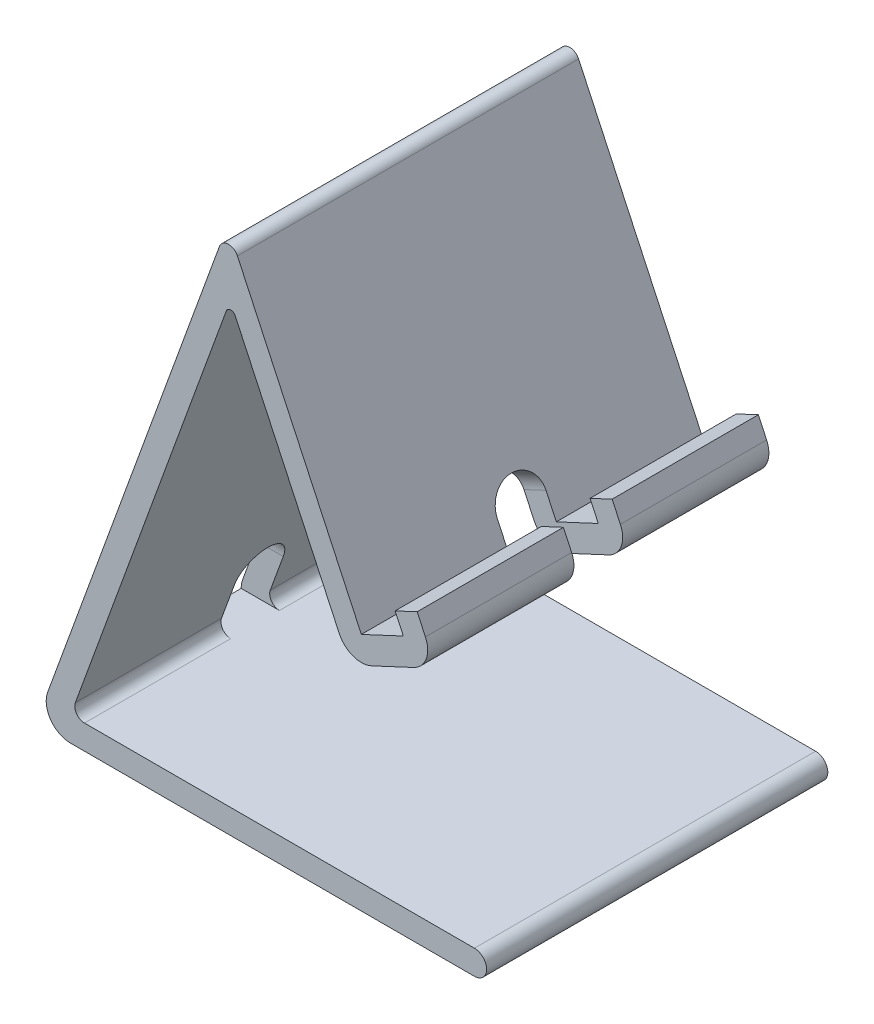
ISO-10303-21;
HEADER;
FILE_DESCRIPTION(('STEP AP214'),'2;1');
FILE_NAME('part.step','',(''),(''),'','','');
FILE_SCHEMA(('AUTOMOTIVE_DESIGN { 1 0 10303 214 1 1 1 1 }'));
ENDSEC;
DATA;
#1=APPLICATION_CONTEXT('core data for automotive mechanical design processes');
#2=APPLICATION_PROTOCOL_DEFINITION('international standard','automotive_design',2000,#1);
#3=PRODUCT_CONTEXT('',#1,'mechanical');
#4=PRODUCT('Part','Part','',(#3));
#5=PRODUCT_RELATED_PRODUCT_CATEGORY('part','',(#4));
#6=PRODUCT_DEFINITION_FORMATION('','',#4);
#7=PRODUCT_DEFINITION_CONTEXT('part definition',#1,'design');
#8=PRODUCT_DEFINITION('design','',#6,#7);
#9=PRODUCT_DEFINITION_SHAPE('','',#8);
#10=(LENGTH_UNIT() NAMED_UNIT(*) SI_UNIT(.MILLI.,.METRE.));
#11=(NAMED_UNIT(*) PLANE_ANGLE_UNIT() SI_UNIT($,.RADIAN.));
#12=(NAMED_UNIT(*) SI_UNIT($,.STERADIAN.) SOLID_ANGLE_UNIT());
#13=UNCERTAINTY_MEASURE_WITH_UNIT(LENGTH_MEASURE(1.E-05),#10,'distance_accuracy_value','');
#14=(GEOMETRIC_REPRESENTATION_CONTEXT(3) GLOBAL_UNCERTAINTY_ASSIGNED_CONTEXT((#13)) GLOBAL_UNIT_ASSIGNED_CONTEXT((#10,
#11,#12)) REPRESENTATION_CONTEXT('',''));
#15=CARTESIAN_POINT('',(0.,0.,0.));
#16=DIRECTION('',(0.,0.,1.));
#17=DIRECTION('',(1.,0.,0.));
#18=AXIS2_PLACEMENT_3D('',#15,#16,#17);
#19=CARTESIAN_POINT('',(7.1407400337106,5.,-70.));
#20=DIRECTION('',(0.,0.,1.));
#21=DIRECTION('',(1.,0.,0.));
#22=AXIS2_PLACEMENT_3D('',#19,#20,#21);
#23=CYLINDRICAL_SURFACE('',#22,5.);
#24=CARTESIAN_POINT('',(7.1407400337106,5.,-30.));
#25=DIRECTION('',(0.,0.,-1.));
#26=DIRECTION('',(-1.,0.,0.));
#27=AXIS2_PLACEMENT_3D('',#24,#25,#26);
#28=CIRCLE('',#27,5.);
#29=CARTESIAN_POINT('',(2.1407400337106,4.99999999999999,-30.));
#30=VERTEX_POINT('',#29);
#31=CARTESIAN_POINT('',(2.44227692978109,6.71010071662841,-30.));
#32=VERTEX_POINT('',#31);
#33=EDGE_CURVE('E291',#30,#32,#28,.T.);
#34=ORIENTED_EDGE('',*,*,#33,.F.);
#35=DIRECTION('',(0.,0.,1.));
#36=VECTOR('',#35,1.);
#37=CARTESIAN_POINT('',(2.1407400337106,4.99999999999999,-70.));
#38=LINE('',#37,#36);
#39=CARTESIAN_POINT('',(2.1407400337106,4.99999999999999,-40.));
#40=VERTEX_POINT('',#39);
#41=EDGE_CURVE('E299',#30,#40,#38,.F.);
#42=ORIENTED_EDGE('',*,*,#41,.T.);
#43=CARTESIAN_POINT('',(7.1407400337106,5.,-40.));
#44=DIRECTION('',(0.,0.,-1.));
#45=DIRECTION('',(0.,1.,0.));
#46=AXIS2_PLACEMENT_3D('',#43,#44,#45);
#47=CIRCLE('',#46,5.);
#48=CARTESIAN_POINT('',(2.44227692978109,6.71010071662841,-40.));
#49=VERTEX_POINT('',#48);
#50=EDGE_CURVE('E293',#40,#49,#47,.T.);
#51=ORIENTED_EDGE('',*,*,#50,.T.);
#52=DIRECTION('',(0.,0.,1.));
#53=VECTOR('',#52,1.);
#54=CARTESIAN_POINT('',(2.44227692978109,6.71010071662841,-70.));
#55=LINE('',#54,#53);
#56=CARTESIAN_POINT('',(2.44227692978109,6.71010071662841,-70.));
#57=VERTEX_POINT('',#56);
#58=EDGE_CURVE('E506',#57,#49,#55,.T.);
#59=ORIENTED_EDGE('',*,*,#58,.F.);
#60=CARTESIAN_POINT('',(7.1407400337106,5.,-70.));
#61=DIRECTION('',(0.,0.,1.));
#62=DIRECTION('',(1.,0.,0.));
#63=AXIS2_PLACEMENT_3D('',#60,#61,#62);
#64=CIRCLE('',#63,5.);
#65=CARTESIAN_POINT('',(7.14074003371066,0.,-70.));
#66=VERTEX_POINT('',#65);
#67=EDGE_CURVE('E372',#66,#57,#64,.F.);
#68=ORIENTED_EDGE('',*,*,#67,.F.);
#69=DIRECTION('',(0.,0.,1.));
#70=VECTOR('',#69,1.);
#71=CARTESIAN_POINT('',(7.14074003371066,0.,-70.));
#72=LINE('',#71,#70);
#73=CARTESIAN_POINT('',(7.14074003371066,0.,0.));
#74=VERTEX_POINT('',#73);
#75=EDGE_CURVE('E436',#66,#74,#72,.T.);
#76=ORIENTED_EDGE('',*,*,#75,.T.);
#77=CARTESIAN_POINT('',(7.1407400337106,5.,0.));
#78=DIRECTION('',(0.,0.,1.));
#79=DIRECTION('',(1.,0.,0.));
#80=AXIS2_PLACEMENT_3D('',#77,#78,#79);
#81=CIRCLE('',#80,5.);
#82=CARTESIAN_POINT('',(2.44227692978109,6.71010071662841,0.));
#83=VERTEX_POINT('',#82);
#84=EDGE_CURVE('E371',#74,#83,#81,.F.);
#85=ORIENTED_EDGE('',*,*,#84,.T.);
#86=EDGE_CURVE('E511',#32,#83,#55,.T.);
#87=ORIENTED_EDGE('',*,*,#86,.F.);
#88=EDGE_LOOP('',(#34,#42,#51,#59,#68,#76,#85,#87));
#89=FACE_BOUND('',#88,.T.);
#90=ADVANCED_FACE('F41',(#89),#23,.T.);
#91=CARTESIAN_POINT('',(0.,0.,-70.));
#92=DIRECTION('',(0.939692620785907,-0.342020143325673,0.));
#93=DIRECTION('',(0.342020143325673,0.939692620785907,0.));
#94=AXIS2_PLACEMENT_3D('',#91,#92,#93);
#95=PLANE('',#94);
#96=DIRECTION('',(0.342020143325673,0.939692620785907,0.));
#97=VECTOR('',#96,1.);
#98=CARTESIAN_POINT('',(0.,0.,-30.));
#99=LINE('',#98,#97);
#100=CARTESIAN_POINT('',(5.45955351399311,15.,-30.));
#101=VERTEX_POINT('',#100);
#102=EDGE_CURVE('E286',#32,#101,#99,.T.);
#103=ORIENTED_EDGE('',*,*,#102,.F.);
#104=ORIENTED_EDGE('',*,*,#86,.T.);
#105=DIRECTION('',(0.342020143325673,0.939692620785907,0.));
#106=VECTOR('',#105,1.);
#107=CARTESIAN_POINT('',(0.,0.,0.));
#108=LINE('',#107,#106);
#109=CARTESIAN_POINT('',(37.6808971452091,103.527414051253,0.));
#110=VERTEX_POINT('',#109);
#111=EDGE_CURVE('E377',#83,#110,#108,.T.);
#112=ORIENTED_EDGE('',*,*,#111,.T.);
#113=DIRECTION('',(0.,0.,1.));
#114=VECTOR('',#113,1.);
#115=CARTESIAN_POINT('',(37.6808971452091,103.527414051253,-70.));
#116=LINE('',#115,#114);
#117=CARTESIAN_POINT('',(37.6808971452091,103.527414051253,-70.));
#118=VERTEX_POINT('',#117);
#119=EDGE_CURVE('E512',#118,#110,#116,.T.);
#120=ORIENTED_EDGE('',*,*,#119,.F.);
#121=DIRECTION('',(0.342020143325673,0.939692620785907,0.));
#122=VECTOR('',#121,1.);
#123=CARTESIAN_POINT('',(0.,0.,-70.));
#124=LINE('',#123,#122);
#125=EDGE_CURVE('E433',#57,#118,#124,.T.);
#126=ORIENTED_EDGE('',*,*,#125,.F.);
#127=ORIENTED_EDGE('',*,*,#58,.T.);
#128=DIRECTION('',(0.342020143325673,0.939692620785907,0.));
#129=VECTOR('',#128,1.);
#130=CARTESIAN_POINT('',(0.,0.,-40.));
#131=LINE('',#130,#129);
#132=CARTESIAN_POINT('',(5.4595535139931,15.,-40.));
#133=VERTEX_POINT('',#132);
#134=EDGE_CURVE('E265',#49,#133,#131,.T.);
#135=ORIENTED_EDGE('',*,*,#134,.T.);
#136=CARTESIAN_POINT('',(5.4595535139931,15.,-35.));
#137=DIRECTION('',(0.939692620785907,-0.342020143325673,0.));
#138=DIRECTION('',(-0.342020143325673,-0.939692620785907,0.));
#139=AXIS2_PLACEMENT_3D('',#136,#137,#138);
#140=ELLIPSE('',#139,5.32088886237957,5.);
#141=EDGE_CURVE('E272',#101,#133,#140,.F.);
#142=ORIENTED_EDGE('',*,*,#141,.F.);
#143=EDGE_LOOP('',(#103,#104,#112,#120,#126,#127,#135,#142));
#144=FACE_BOUND('',#143,.T.);
#145=ADVANCED_FACE('F643',(#144),#95,.F.);
#146=CARTESIAN_POINT('',(4.69846310392953,-1.71010071662836,-70.));
#147=DIRECTION('',(0.939692620785907,-0.342020143325673,0.));
#148=DIRECTION('',(0.342020143325673,0.939692620785907,0.));
#149=AXIS2_PLACEMENT_3D('',#146,#147,#148);
#150=PLANE('',#149);
#151=DIRECTION('',(0.,0.,1.));
#152=VECTOR('',#151,1.);
#153=CARTESIAN_POINT('',(8.11765080562302,7.68404028665133,-70.));
#154=LINE('',#153,#152);
#155=CARTESIAN_POINT('',(8.11765080562302,7.68404028665134,-30.));
#156=VERTEX_POINT('',#155);
#157=CARTESIAN_POINT('',(8.11765080562302,7.68404028665133,0.));
#158=VERTEX_POINT('',#157);
#159=EDGE_CURVE('E282',#156,#158,#154,.T.);
#160=ORIENTED_EDGE('',*,*,#159,.F.);
#161=DIRECTION('',(0.342020143325673,0.939692620785907,0.));
#162=VECTOR('',#161,1.);
#163=CARTESIAN_POINT('',(4.69846310392953,-1.71010071662836,-30.));
#164=LINE('',#163,#162);
#165=CARTESIAN_POINT('',(10.7804423763727,15.,-30.));
#166=VERTEX_POINT('',#165);
#167=EDGE_CURVE('E280',#156,#166,#164,.T.);
#168=ORIENTED_EDGE('',*,*,#167,.T.);
#169=CARTESIAN_POINT('',(10.7804423763727,15.,-35.));
#170=DIRECTION('',(0.939692620785907,-0.342020143325673,0.));
#171=DIRECTION('',(-0.342020143325673,-0.939692620785907,0.));
#172=AXIS2_PLACEMENT_3D('',#169,#170,#171);
#173=ELLIPSE('',#172,5.32088886237957,5.);
#174=CARTESIAN_POINT('',(10.7804423763727,15.,-40.));
#175=VERTEX_POINT('',#174);
#176=EDGE_CURVE('E11',#166,#175,#173,.F.);
#177=ORIENTED_EDGE('',*,*,#176,.T.);
#178=DIRECTION('',(0.342020143325673,0.939692620785907,0.));
#179=VECTOR('',#178,1.);
#180=CARTESIAN_POINT('',(4.69846310392951,-1.71010071662844,-40.));
#181=LINE('',#180,#179);
#182=CARTESIAN_POINT('',(8.11765080562302,7.68404028665134,-40.));
#183=VERTEX_POINT('',#182);
#184=EDGE_CURVE('E259',#183,#175,#181,.T.);
#185=ORIENTED_EDGE('',*,*,#184,.F.);
#186=CARTESIAN_POINT('',(8.11765080562302,7.68404028665133,-70.));
#187=VERTEX_POINT('',#186);
#188=EDGE_CURVE('E564',#187,#183,#154,.T.);
#189=ORIENTED_EDGE('',*,*,#188,.F.);
#190=DIRECTION('',(0.342020143325673,0.939692620785907,0.));
#191=VECTOR('',#190,1.);
#192=CARTESIAN_POINT('',(4.69846310392953,-1.71010071662836,-70.));
#193=LINE('',#192,#191);
#194=CARTESIAN_POINT('',(39.0765215746521,92.7428386563713,-70.));
#195=VERTEX_POINT('',#194);
#196=EDGE_CURVE('E391',#187,#195,#193,.T.);
#197=ORIENTED_EDGE('',*,*,#196,.T.);
#198=DIRECTION('',(0.,0.,1.));
#199=VECTOR('',#198,1.);
#200=CARTESIAN_POINT('',(39.0765215746521,92.7428386563713,-70.));
#201=LINE('',#200,#199);
#202=CARTESIAN_POINT('',(39.0765215746521,92.7428386563713,0.));
#203=VERTEX_POINT('',#202);
#204=EDGE_CURVE('E561',#195,#203,#201,.T.);
#205=ORIENTED_EDGE('',*,*,#204,.T.);
#206=DIRECTION('',(0.342020143325673,0.939692620785907,0.));
#207=VECTOR('',#206,1.);
#208=CARTESIAN_POINT('',(4.69846310392953,-1.71010071662836,0.));
#209=LINE('',#208,#207);
#210=EDGE_CURVE('E455',#158,#203,#209,.T.);
#211=ORIENTED_EDGE('',*,*,#210,.F.);
#212=EDGE_LOOP('',(#160,#168,#177,#185,#189,#197,#205,#211));
#213=FACE_BOUND('',#212,.T.);
#214=ADVANCED_FACE('F279',(#213),#150,.T.);
#215=CARTESIAN_POINT('',(9.99703604719483,6.99999999999999,-70.));
#216=DIRECTION('',(0.,0.,1.));
#217=DIRECTION('',(1.,0.,0.));
#218=AXIS2_PLACEMENT_3D('',#215,#216,#217);
#219=CYLINDRICAL_SURFACE('',#218,2.);
#220=CARTESIAN_POINT('',(9.99703604719483,6.99999999999999,-30.));
#221=DIRECTION('',(0.,0.,-1.));
#222=DIRECTION('',(-1.,0.,0.));
#223=AXIS2_PLACEMENT_3D('',#220,#221,#222);
#224=CIRCLE('',#223,2.);
#225=CARTESIAN_POINT('',(9.99703604719483,4.99999999999999,-30.));
#226=VERTEX_POINT('',#225);
#227=EDGE_CURVE('E287',#156,#226,#224,.F.);
#228=ORIENTED_EDGE('',*,*,#227,.F.);
#229=ORIENTED_EDGE('',*,*,#159,.T.);
#230=CARTESIAN_POINT('',(9.99703604719483,6.99999999999999,0.));
#231=DIRECTION('',(0.,0.,1.));
#232=DIRECTION('',(1.,0.,0.));
#233=AXIS2_PLACEMENT_3D('',#230,#231,#232);
#234=CIRCLE('',#233,2.);
#235=CARTESIAN_POINT('',(9.99703604719483,4.99999999999999,0.));
#236=VERTEX_POINT('',#235);
#237=EDGE_CURVE('E451',#158,#236,#234,.T.);
#238=ORIENTED_EDGE('',*,*,#237,.T.);
#239=DIRECTION('',(0.,0.,1.));
#240=VECTOR('',#239,1.);
#241=CARTESIAN_POINT('',(9.99703604719483,4.99999999999999,-70.));
#242=LINE('',#241,#240);
#243=EDGE_CURVE('E571',#226,#236,#242,.T.);
#244=ORIENTED_EDGE('',*,*,#243,.F.);
#245=EDGE_LOOP('',(#228,#229,#238,#244));
#246=FACE_BOUND('',#245,.T.);
#247=ADVANCED_FACE('F614',(#246),#219,.F.);
#248=CARTESIAN_POINT('',(73.6984839364156,34.3661674539629,-70.));
#249=DIRECTION('',(-0.906307787036654,-0.422618261740691,0.));
#250=DIRECTION('',(0.422618261740691,-0.906307787036654,0.));
#251=AXIS2_PLACEMENT_3D('',#248,#249,#250);
#252=PLANE('',#251);
#253=DIRECTION('',(0.422618261740691,-0.906307787036654,0.));
#254=VECTOR('',#253,1.);
#255=CARTESIAN_POINT('',(73.6984839364156,34.3661674539629,-30.));
#256=LINE('',#255,#254);
#257=CARTESIAN_POINT('',(64.6894121868938,53.6861841681801,-30.));
#258=VERTEX_POINT('',#257);
#259=CARTESIAN_POINT('',(66.8025034955973,49.1546452329968,-30.));
#260=VERTEX_POINT('',#259);
#261=EDGE_CURVE('E365',#258,#260,#256,.T.);
#262=ORIENTED_EDGE('',*,*,#261,.F.);
#263=CARTESIAN_POINT('',(64.6894121868938,53.6861841681801,-35.));
#264=DIRECTION('',(-0.906307787036654,-0.422618261740691,0.));
#265=DIRECTION('',(0.422618261740691,-0.906307787036654,0.));
#266=AXIS2_PLACEMENT_3D('',#263,#264,#265);
#267=CIRCLE('',#266,5.);
#268=CARTESIAN_POINT('',(64.6894121868938,53.6861841681801,-40.));
#269=VERTEX_POINT('',#268);
#270=EDGE_CURVE('E368',#269,#258,#267,.F.);
#271=ORIENTED_EDGE('',*,*,#270,.F.);
#272=DIRECTION('',(0.422618261740691,-0.906307787036654,0.));
#273=VECTOR('',#272,1.);
#274=CARTESIAN_POINT('',(73.6984839364156,34.3661674539629,-40.));
#275=LINE('',#274,#273);
#276=CARTESIAN_POINT('',(66.8025034955973,49.1546452329968,-40.));
#277=VERTEX_POINT('',#276);
#278=EDGE_CURVE('E342',#269,#277,#275,.T.);
#279=ORIENTED_EDGE('',*,*,#278,.T.);
#280=DIRECTION('',(0.,0.,1.));
#281=VECTOR('',#280,1.);
#282=CARTESIAN_POINT('',(66.8025034955973,49.1546452329968,-70.));
#283=LINE('',#282,#281);
#284=CARTESIAN_POINT('',(66.8025034955973,49.1546452329968,-70.));
#285=VERTEX_POINT('',#284);
#286=EDGE_CURVE('E518',#285,#277,#283,.T.);
#287=ORIENTED_EDGE('',*,*,#286,.F.);
#288=DIRECTION('',(0.422618261740691,-0.906307787036654,0.));
#289=VECTOR('',#288,1.);
#290=CARTESIAN_POINT('',(73.6984839364156,34.3661674539629,-70.));
#291=LINE('',#290,#289);
#292=CARTESIAN_POINT('',(41.3728979608542,103.688610288083,-70.));
#293=VERTEX_POINT('',#292);
#294=EDGE_CURVE('E426',#293,#285,#291,.T.);
#295=ORIENTED_EDGE('',*,*,#294,.F.);
#296=DIRECTION('',(0.,0.,1.));
#297=VECTOR('',#296,1.);
#298=CARTESIAN_POINT('',(41.3728979608542,103.688610288083,-70.));
#299=LINE('',#298,#297);
#300=CARTESIAN_POINT('',(41.3728979608542,103.688610288083,0.));
#301=VERTEX_POINT('',#300);
#302=EDGE_CURVE('E515',#293,#301,#299,.T.);
#303=ORIENTED_EDGE('',*,*,#302,.T.);
#304=DIRECTION('',(0.422618261740691,-0.906307787036654,0.));
#305=VECTOR('',#304,1.);
#306=CARTESIAN_POINT('',(73.6984839364156,34.3661674539629,0.));
#307=LINE('',#306,#305);
#308=CARTESIAN_POINT('',(66.8025034955973,49.1546452329968,0.));
#309=VERTEX_POINT('',#308);
#310=EDGE_CURVE('E495',#301,#309,#307,.T.);
#311=ORIENTED_EDGE('',*,*,#310,.T.);
#312=EDGE_CURVE('E522',#260,#309,#283,.T.);
#313=ORIENTED_EDGE('',*,*,#312,.F.);
#314=EDGE_LOOP('',(#262,#271,#279,#287,#295,#303,#311,#313));
#315=FACE_BOUND('',#314,.T.);
#316=ADVANCED_FACE('F683',(#315),#252,.F.);
#317=CARTESIAN_POINT('',(-6.89598044081838,14.788477779034,-70.));
#318=DIRECTION('',(0.422618261740691,-0.906307787036654,0.));
#319=DIRECTION('',(0.906307787036654,0.422618261740691,0.));
#320=AXIS2_PLACEMENT_3D('',#317,#318,#319);
#321=PLANE('',#320);
#322=DIRECTION('',(0.906307787036654,0.422618261740691,0.));
#323=VECTOR('',#322,1.);
#324=CARTESIAN_POINT('',(-6.89598044081838,14.788477779034,-30.));
#325=LINE('',#324,#323);
#326=CARTESIAN_POINT('',(75.4124274724455,53.1695187195334,-30.));
#327=VERTEX_POINT('',#326);
#328=EDGE_CURVE('E362',#260,#327,#325,.T.);
#329=ORIENTED_EDGE('',*,*,#328,.F.);
#330=ORIENTED_EDGE('',*,*,#312,.T.);
#331=DIRECTION('',(0.906307787036654,0.422618261740691,0.));
#332=VECTOR('',#331,1.);
#333=CARTESIAN_POINT('',(-6.89598044081838,14.788477779034,0.));
#334=LINE('',#333,#332);
#335=CARTESIAN_POINT('',(75.4124274724455,53.1695187195334,0.));
#336=VERTEX_POINT('',#335);
#337=EDGE_CURVE('E491',#309,#336,#334,.T.);
#338=ORIENTED_EDGE('',*,*,#337,.T.);
#339=DIRECTION('',(0.,0.,1.));
#340=VECTOR('',#339,1.);
#341=CARTESIAN_POINT('',(75.4124274724455,53.1695187195334,-70.));
#342=LINE('',#341,#340);
#343=EDGE_CURVE('E527',#327,#336,#342,.T.);
#344=ORIENTED_EDGE('',*,*,#343,.F.);
#345=EDGE_LOOP('',(#329,#330,#338,#344));
#346=FACE_BOUND('',#345,.T.);
#347=ADVANCED_FACE('F686',(#346),#321,.F.);
#348=CARTESIAN_POINT('',(82.3084079132638,38.3810409404995,-70.));
#349=DIRECTION('',(0.906307787036654,0.422618261740692,0.));
#350=DIRECTION('',(-0.422618261740692,0.906307787036654,0.));
#351=AXIS2_PLACEMENT_3D('',#348,#349,#350);
#352=PLANE('',#351);
#353=DIRECTION('',(-0.422618261740692,0.906307787036654,0.));
#354=VECTOR('',#353,1.);
#355=CARTESIAN_POINT('',(82.3084079132638,38.3810409404996,-30.));
#356=LINE('',#355,#354);
#357=CARTESIAN_POINT('',(73.7219544254827,56.79474986768,-30.));
#358=VERTEX_POINT('',#357);
#359=EDGE_CURVE('E359',#327,#358,#356,.T.);
#360=ORIENTED_EDGE('',*,*,#359,.F.);
#361=ORIENTED_EDGE('',*,*,#343,.T.);
#362=DIRECTION('',(-0.422618261740692,0.906307787036654,0.));
#363=VECTOR('',#362,1.);
#364=CARTESIAN_POINT('',(82.3084079132638,38.3810409404995,0.));
#365=LINE('',#364,#363);
#366=CARTESIAN_POINT('',(73.7219544254827,56.79474986768,0.));
#367=VERTEX_POINT('',#366);
#368=EDGE_CURVE('E487',#336,#367,#365,.T.);
#369=ORIENTED_EDGE('',*,*,#368,.T.);
#370=DIRECTION('',(0.,0.,1.));
#371=VECTOR('',#370,1.);
#372=CARTESIAN_POINT('',(73.7219544254827,56.79474986768,-70.));
#373=LINE('',#372,#371);
#374=EDGE_CURVE('E532',#358,#367,#373,.T.);
#375=ORIENTED_EDGE('',*,*,#374,.F.);
#376=EDGE_LOOP('',(#360,#361,#369,#375));
#377=FACE_BOUND('',#376,.T.);
#378=ADVANCED_FACE('F696',(#377),#352,.F.);
#379=CARTESIAN_POINT('',(-8.5864534877811,18.4137089271804,-70.));
#380=DIRECTION('',(0.422618261740693,-0.906307787036653,0.));
#381=DIRECTION('',(0.906307787036653,0.422618261740693,0.));
#382=AXIS2_PLACEMENT_3D('',#379,#380,#381);
#383=PLANE('',#382);
#384=DIRECTION('',(0.906307787036653,0.422618261740693,0.));
#385=VECTOR('',#384,1.);
#386=CARTESIAN_POINT('',(-8.5864534877811,18.4137089271804,-30.));
#387=LINE('',#386,#385);
#388=CARTESIAN_POINT('',(78.253493360666,58.9078411763835,-30.));
#389=VERTEX_POINT('',#388);
#390=EDGE_CURVE('E356',#358,#389,#387,.T.);
#391=ORIENTED_EDGE('',*,*,#390,.F.);
#392=ORIENTED_EDGE('',*,*,#374,.T.);
#393=DIRECTION('',(0.906307787036653,0.422618261740693,0.));
#394=VECTOR('',#393,1.);
#395=CARTESIAN_POINT('',(-8.5864534877811,18.4137089271804,0.));
#396=LINE('',#395,#394);
#397=CARTESIAN_POINT('',(78.253493360666,58.9078411763835,0.));
#398=VERTEX_POINT('',#397);
#399=EDGE_CURVE('E483',#367,#398,#396,.T.);
#400=ORIENTED_EDGE('',*,*,#399,.T.);
#401=DIRECTION('',(0.,0.,1.));
#402=VECTOR('',#401,1.);
#403=CARTESIAN_POINT('',(78.253493360666,58.9078411763835,-70.));
#404=LINE('',#403,#402);
#405=EDGE_CURVE('E537',#389,#398,#404,.T.);
#406=ORIENTED_EDGE('',*,*,#405,.F.);
#407=EDGE_LOOP('',(#391,#392,#400,#406));
#408=FACE_BOUND('',#407,.T.);
#409=ADVANCED_FACE('F701',(#408),#383,.F.);
#410=CARTESIAN_POINT('',(86.8399468484471,40.494132249203,-70.));
#411=DIRECTION('',(-0.906307787036653,-0.422618261740692,0.));
#412=DIRECTION('',(0.422618261740692,-0.906307787036653,0.));
#413=AXIS2_PLACEMENT_3D('',#410,#411,#412);
#414=PLANE('',#413);
#415=DIRECTION('',(0.422618261740692,-0.906307787036653,0.));
#416=VECTOR('',#415,1.);
#417=CARTESIAN_POINT('',(86.8399468484471,40.4941322492031,-30.));
#418=LINE('',#417,#416);
#419=CARTESIAN_POINT('',(79.9439664076287,55.2826100282369,-30.));
#420=VERTEX_POINT('',#419);
#421=EDGE_CURVE('E353',#389,#420,#418,.T.);
#422=ORIENTED_EDGE('',*,*,#421,.F.);
#423=ORIENTED_EDGE('',*,*,#405,.T.);
#424=DIRECTION('',(0.422618261740692,-0.906307787036653,0.));
#425=VECTOR('',#424,1.);
#426=CARTESIAN_POINT('',(86.8399468484471,40.494132249203,0.));
#427=LINE('',#426,#425);
#428=CARTESIAN_POINT('',(79.9439664076287,55.2826100282369,0.));
#429=VERTEX_POINT('',#428);
#430=EDGE_CURVE('E479',#398,#429,#427,.T.);
#431=ORIENTED_EDGE('',*,*,#430,.T.);
#432=DIRECTION('',(0.,0.,1.));
#433=VECTOR('',#432,1.);
#434=CARTESIAN_POINT('',(79.9439664076287,55.2826100282369,-70.));
#435=LINE('',#434,#433);
#436=EDGE_CURVE('E542',#420,#429,#435,.T.);
#437=ORIENTED_EDGE('',*,*,#436,.F.);
#438=EDGE_LOOP('',(#422,#423,#431,#437));
#439=FACE_BOUND('',#438,.T.);
#440=ADVANCED_FACE('F706',(#439),#414,.F.);
#441=CARTESIAN_POINT('',(75.4124274724455,53.1695187195334,-70.));
#442=DIRECTION('',(0.,0.,1.));
#443=DIRECTION('',(1.,0.,0.));
#444=AXIS2_PLACEMENT_3D('',#441,#442,#443);
#445=CYLINDRICAL_SURFACE('',#444,5.);
#446=DIRECTION('',(0.,0.,1.));
#447=VECTOR('',#446,1.);
#448=CARTESIAN_POINT('',(77.5255187811489,48.6379797843501,-70.));
#449=LINE('',#448,#447);
#450=CARTESIAN_POINT('',(77.5255187811489,48.6379797843501,-30.));
#451=VERTEX_POINT('',#450);
#452=CARTESIAN_POINT('',(77.5255187811489,48.6379797843501,0.));
#453=VERTEX_POINT('',#452);
#454=EDGE_CURVE('E547',#451,#453,#449,.T.);
#455=ORIENTED_EDGE('',*,*,#454,.F.);
#456=CARTESIAN_POINT('',(75.4124274724455,53.1695187195334,-30.));
#457=DIRECTION('',(0.,0.,-1.));
#458=DIRECTION('',(0.,1.,0.));
#459=AXIS2_PLACEMENT_3D('',#456,#457,#458);
#460=CIRCLE('',#459,5.);
#461=EDGE_CURVE('E349',#451,#420,#460,.F.);
#462=ORIENTED_EDGE('',*,*,#461,.T.);
#463=ORIENTED_EDGE('',*,*,#436,.T.);
#464=CARTESIAN_POINT('',(75.4124274724455,53.1695187195334,0.));
#465=DIRECTION('',(0.,0.,1.));
#466=DIRECTION('',(1.,0.,0.));
#467=AXIS2_PLACEMENT_3D('',#464,#465,#466);
#468=CIRCLE('',#467,5.);
#469=EDGE_CURVE('E475',#453,#429,#468,.T.);
#470=ORIENTED_EDGE('',*,*,#469,.F.);
#471=EDGE_LOOP('',(#455,#462,#463,#470));
#472=FACE_BOUND('',#471,.T.);
#473=ADVANCED_FACE('F711',(#472),#445,.T.);
#474=CARTESIAN_POINT('',(-4.7828891321149,10.2569388438506,-70.));
#475=DIRECTION('',(0.422618261740692,-0.906307787036654,0.));
#476=DIRECTION('',(0.906307787036654,0.422618261740692,0.));
#477=AXIS2_PLACEMENT_3D('',#474,#475,#476);
#478=PLANE('',#477);
#479=DIRECTION('',(0.,0.,1.));
#480=VECTOR('',#479,1.);
#481=CARTESIAN_POINT('',(68.9155948043008,44.6231062978136,-70.));
#482=LINE('',#481,#480);
#483=CARTESIAN_POINT('',(68.9155948043007,44.6231062978136,-30.));
#484=VERTEX_POINT('',#483);
#485=CARTESIAN_POINT('',(68.9155948043008,44.6231062978136,0.));
#486=VERTEX_POINT('',#485);
#487=EDGE_CURVE('E552',#484,#486,#482,.T.);
#488=ORIENTED_EDGE('',*,*,#487,.F.);
#489=DIRECTION('',(-0.906307787036654,-0.422618261740691,0.));
#490=VECTOR('',#489,1.);
#491=CARTESIAN_POINT('',(105.167906285767,61.5278367674412,-30.));
#492=LINE('',#491,#490);
#493=EDGE_CURVE('E309',#451,#484,#492,.T.);
#494=ORIENTED_EDGE('',*,*,#493,.F.);
#495=ORIENTED_EDGE('',*,*,#454,.T.);
#496=DIRECTION('',(0.906307787036654,0.422618261740692,0.));
#497=VECTOR('',#496,1.);
#498=CARTESIAN_POINT('',(-4.7828891321149,10.2569388438506,0.));
#499=LINE('',#498,#497);
#500=EDGE_CURVE('E471',#486,#453,#499,.T.);
#501=ORIENTED_EDGE('',*,*,#500,.F.);
#502=EDGE_LOOP('',(#488,#494,#495,#501));
#503=FACE_BOUND('',#502,.T.);
#504=ADVANCED_FACE('F716',(#503),#478,.T.);
#505=CARTESIAN_POINT('',(66.8025034955973,49.1546452329968,-70.));
#506=DIRECTION('',(0.,0.,1.));
#507=DIRECTION('',(1.,0.,0.));
#508=AXIS2_PLACEMENT_3D('',#505,#506,#507);
#509=CYLINDRICAL_SURFACE('',#508,5.);
#510=CARTESIAN_POINT('',(66.8025034955973,49.1546452329968,-30.));
#511=DIRECTION('',(0.,0.,-1.));
#512=DIRECTION('',(0.,1.,0.));
#513=AXIS2_PLACEMENT_3D('',#510,#511,#512);
#514=CIRCLE('',#513,5.);
#515=CARTESIAN_POINT('',(62.270964560414,47.0415539242934,-30.));
#516=VERTEX_POINT('',#515);
#517=EDGE_CURVE('E346',#484,#516,#514,.T.);
#518=ORIENTED_EDGE('',*,*,#517,.F.);
#519=ORIENTED_EDGE('',*,*,#487,.T.);
#520=CARTESIAN_POINT('',(66.8025034955973,49.1546452329968,0.));
#521=DIRECTION('',(0.,0.,1.));
#522=DIRECTION('',(1.,0.,0.));
#523=AXIS2_PLACEMENT_3D('',#520,#521,#522);
#524=CIRCLE('',#523,5.);
#525=CARTESIAN_POINT('',(62.270964560414,47.0415539242934,0.));
#526=VERTEX_POINT('',#525);
#527=EDGE_CURVE('E467',#486,#526,#524,.F.);
#528=ORIENTED_EDGE('',*,*,#527,.T.);
#529=DIRECTION('',(0.,0.,1.));
#530=VECTOR('',#529,1.);
#531=CARTESIAN_POINT('',(62.270964560414,47.0415539242934,-70.));
#532=LINE('',#531,#530);
#533=EDGE_CURVE('E557',#516,#526,#532,.T.);
#534=ORIENTED_EDGE('',*,*,#533,.F.);
#535=EDGE_LOOP('',(#518,#519,#528,#534));
#536=FACE_BOUND('',#535,.T.);
#537=ADVANCED_FACE('F598',(#536),#509,.T.);
#538=CARTESIAN_POINT('',(69.1669450012324,32.2530761452595,-70.));
#539=DIRECTION('',(-0.906307787036654,-0.422618261740691,0.));
#540=DIRECTION('',(0.422618261740691,-0.906307787036654,0.));
#541=AXIS2_PLACEMENT_3D('',#538,#539,#540);
#542=PLANE('',#541);
#543=CARTESIAN_POINT('',(60.1578732517105,51.5730928594767,-35.));
#544=DIRECTION('',(-0.906307787036654,-0.422618261740691,0.));
#545=DIRECTION('',(0.422618261740691,-0.906307787036654,0.));
#546=AXIS2_PLACEMENT_3D('',#543,#544,#545);
#547=CIRCLE('',#546,5.);
#548=CARTESIAN_POINT('',(60.1578732517105,51.5730928594767,-40.));
#549=VERTEX_POINT('',#548);
#550=CARTESIAN_POINT('',(60.1578732517105,51.5730928594767,-30.));
#551=VERTEX_POINT('',#550);
#552=EDGE_CURVE('E583',#549,#551,#547,.F.);
#553=ORIENTED_EDGE('',*,*,#552,.T.);
#554=DIRECTION('',(0.422618261740691,-0.906307787036654,0.));
#555=VECTOR('',#554,1.);
#556=CARTESIAN_POINT('',(69.1669450012323,32.2530761452595,-30.));
#557=LINE('',#556,#555);
#558=EDGE_CURVE('E49',#551,#516,#557,.T.);
#559=ORIENTED_EDGE('',*,*,#558,.T.);
#560=ORIENTED_EDGE('',*,*,#533,.T.);
#561=DIRECTION('',(0.422618261740691,-0.906307787036654,0.));
#562=VECTOR('',#561,1.);
#563=CARTESIAN_POINT('',(69.1669450012324,32.2530761452595,0.));
#564=LINE('',#563,#562);
#565=CARTESIAN_POINT('',(40.9225219824746,92.8234367747864,0.));
#566=VERTEX_POINT('',#565);
#567=EDGE_CURVE('E463',#566,#526,#564,.T.);
#568=ORIENTED_EDGE('',*,*,#567,.F.);
#569=DIRECTION('',(0.,0.,1.));
#570=VECTOR('',#569,1.);
#571=CARTESIAN_POINT('',(40.9225219824746,92.8234367747864,-70.));
#572=LINE('',#571,#570);
#573=CARTESIAN_POINT('',(40.9225219824746,92.8234367747864,-70.));
#574=VERTEX_POINT('',#573);
#575=EDGE_CURVE('E558',#574,#566,#572,.T.);
#576=ORIENTED_EDGE('',*,*,#575,.F.);
#577=DIRECTION('',(0.422618261740691,-0.906307787036654,0.));
#578=VECTOR('',#577,1.);
#579=CARTESIAN_POINT('',(69.1669450012324,32.2530761452595,-70.));
#580=LINE('',#579,#578);
#581=CARTESIAN_POINT('',(62.270964560414,47.0415539242934,-70.));
#582=VERTEX_POINT('',#581);
#583=EDGE_CURVE('E399',#574,#582,#580,.T.);
#584=ORIENTED_EDGE('',*,*,#583,.T.);
#585=CARTESIAN_POINT('',(62.270964560414,47.0415539242934,-40.));
#586=VERTEX_POINT('',#585);
#587=EDGE_CURVE('E553',#582,#586,#532,.T.);
#588=ORIENTED_EDGE('',*,*,#587,.T.);
#589=DIRECTION('',(0.422618261740691,-0.906307787036654,0.));
#590=VECTOR('',#589,1.);
#591=CARTESIAN_POINT('',(69.1669450012324,32.2530761452595,-40.));
#592=LINE('',#591,#590);
#593=EDGE_CURVE('E510',#549,#586,#592,.T.);
#594=ORIENTED_EDGE('',*,*,#593,.F.);
#595=EDGE_LOOP('',(#553,#559,#560,#568,#576,#584,#588,#594));
#596=FACE_BOUND('',#595,.T.);
#597=ADVANCED_FACE('F590',(#596),#542,.T.);
#598=CARTESIAN_POINT('',(39.5602823867809,102.843373764601,-70.));
#599=DIRECTION('',(0.,0.,1.));
#600=DIRECTION('',(1.,0.,0.));
#601=AXIS2_PLACEMENT_3D('',#598,#599,#600);
#602=CYLINDRICAL_SURFACE('',#601,2.);
#603=CARTESIAN_POINT('',(39.5602823867809,102.843373764601,0.));
#604=DIRECTION('',(0.,0.,1.));
#605=DIRECTION('',(1.,0.,0.));
#606=AXIS2_PLACEMENT_3D('',#603,#604,#605);
#607=CIRCLE('',#606,2.);
#608=EDGE_CURVE('E499',#301,#110,#607,.T.);
#609=ORIENTED_EDGE('',*,*,#608,.F.);
#610=ORIENTED_EDGE('',*,*,#302,.F.);
#611=CARTESIAN_POINT('',(39.5602823867809,102.843373764601,-70.));
#612=DIRECTION('',(0.,0.,1.));
#613=DIRECTION('',(1.,0.,0.));
#614=AXIS2_PLACEMENT_3D('',#611,#612,#613);
#615=CIRCLE('',#614,2.);
#616=EDGE_CURVE('E429',#293,#118,#615,.T.);
#617=ORIENTED_EDGE('',*,*,#616,.T.);
#618=ORIENTED_EDGE('',*,*,#119,.T.);
#619=EDGE_LOOP('',(#609,#610,#617,#618));
#620=FACE_BOUND('',#619,.T.);
#621=ADVANCED_FACE('F678',(#620),#602,.T.);
#622=ORIENTED_EDGE('',*,*,#286,.T.);
#623=DIRECTION('',(0.906307787036654,0.422618261740691,0.));
#624=VECTOR('',#623,1.);
#625=CARTESIAN_POINT('',(-6.89598044081838,14.788477779034,-40.));
#626=LINE('',#625,#624);
#627=CARTESIAN_POINT('',(75.4124274724455,53.1695187195334,-40.));
#628=VERTEX_POINT('',#627);
#629=EDGE_CURVE('E338',#277,#628,#626,.T.);
#630=ORIENTED_EDGE('',*,*,#629,.T.);
#631=CARTESIAN_POINT('',(75.4124274724455,53.1695187195334,-70.));
#632=VERTEX_POINT('',#631);
#633=EDGE_CURVE('E523',#632,#628,#342,.T.);
#634=ORIENTED_EDGE('',*,*,#633,.F.);
#635=DIRECTION('',(0.906307787036654,0.422618261740691,0.));
#636=VECTOR('',#635,1.);
#637=CARTESIAN_POINT('',(-6.89598044081838,14.788477779034,-70.));
#638=LINE('',#637,#636);
#639=EDGE_CURVE('E423',#285,#632,#638,.T.);
#640=ORIENTED_EDGE('',*,*,#639,.F.);
#641=EDGE_LOOP('',(#622,#630,#634,#640));
#642=FACE_BOUND('',#641,.T.);
#643=ADVANCED_FACE('F681',(#642),#321,.F.);
#644=ORIENTED_EDGE('',*,*,#633,.T.);
#645=DIRECTION('',(-0.422618261740692,0.906307787036654,0.));
#646=VECTOR('',#645,1.);
#647=CARTESIAN_POINT('',(82.3084079132638,38.3810409404995,-40.));
#648=LINE('',#647,#646);
#649=CARTESIAN_POINT('',(73.7219544254827,56.79474986768,-40.));
#650=VERTEX_POINT('',#649);
#651=EDGE_CURVE('E334',#628,#650,#648,.T.);
#652=ORIENTED_EDGE('',*,*,#651,.T.);
#653=CARTESIAN_POINT('',(73.7219544254827,56.79474986768,-70.));
#654=VERTEX_POINT('',#653);
#655=EDGE_CURVE('E528',#654,#650,#373,.T.);
#656=ORIENTED_EDGE('',*,*,#655,.F.);
#657=DIRECTION('',(-0.422618261740692,0.906307787036654,0.));
#658=VECTOR('',#657,1.);
#659=CARTESIAN_POINT('',(82.3084079132638,38.3810409404995,-70.));
#660=LINE('',#659,#658);
#661=EDGE_CURVE('E420',#632,#654,#660,.T.);
#662=ORIENTED_EDGE('',*,*,#661,.F.);
#663=EDGE_LOOP('',(#644,#652,#656,#662));
#664=FACE_BOUND('',#663,.T.);
#665=ADVANCED_FACE('F690',(#664),#352,.F.);
#666=ORIENTED_EDGE('',*,*,#655,.T.);
#667=DIRECTION('',(0.906307787036653,0.422618261740693,0.));
#668=VECTOR('',#667,1.);
#669=CARTESIAN_POINT('',(-8.5864534877811,18.4137089271804,-40.));
#670=LINE('',#669,#668);
#671=CARTESIAN_POINT('',(78.253493360666,58.9078411763835,-40.));
#672=VERTEX_POINT('',#671);
#673=EDGE_CURVE('E330',#650,#672,#670,.T.);
#674=ORIENTED_EDGE('',*,*,#673,.T.);
#675=CARTESIAN_POINT('',(78.253493360666,58.9078411763835,-70.));
#676=VERTEX_POINT('',#675);
#677=EDGE_CURVE('E533',#676,#672,#404,.T.);
#678=ORIENTED_EDGE('',*,*,#677,.F.);
#679=DIRECTION('',(0.906307787036653,0.422618261740693,0.));
#680=VECTOR('',#679,1.);
#681=CARTESIAN_POINT('',(-8.5864534877811,18.4137089271804,-70.));
#682=LINE('',#681,#680);
#683=EDGE_CURVE('E417',#654,#676,#682,.T.);
#684=ORIENTED_EDGE('',*,*,#683,.F.);
#685=EDGE_LOOP('',(#666,#674,#678,#684));
#686=FACE_BOUND('',#685,.T.);
#687=ADVANCED_FACE('F694',(#686),#383,.F.);
#688=ORIENTED_EDGE('',*,*,#677,.T.);
#689=DIRECTION('',(0.422618261740692,-0.906307787036653,0.));
#690=VECTOR('',#689,1.);
#691=CARTESIAN_POINT('',(86.8399468484471,40.494132249203,-40.));
#692=LINE('',#691,#690);
#693=CARTESIAN_POINT('',(79.9439664076287,55.2826100282369,-40.));
#694=VERTEX_POINT('',#693);
#695=EDGE_CURVE('E326',#672,#694,#692,.T.);
#696=ORIENTED_EDGE('',*,*,#695,.T.);
#697=CARTESIAN_POINT('',(79.9439664076287,55.2826100282369,-70.));
#698=VERTEX_POINT('',#697);
#699=EDGE_CURVE('E538',#698,#694,#435,.T.);
#700=ORIENTED_EDGE('',*,*,#699,.F.);
#701=DIRECTION('',(0.422618261740692,-0.906307787036653,0.));
#702=VECTOR('',#701,1.);
#703=CARTESIAN_POINT('',(86.8399468484471,40.494132249203,-70.));
#704=LINE('',#703,#702);
#705=EDGE_CURVE('E414',#676,#698,#704,.T.);
#706=ORIENTED_EDGE('',*,*,#705,.F.);
#707=EDGE_LOOP('',(#688,#696,#700,#706));
#708=FACE_BOUND('',#707,.T.);
#709=ADVANCED_FACE('F699',(#708),#414,.F.);
#710=CARTESIAN_POINT('',(75.4124274724455,53.1695187195334,-40.));
#711=DIRECTION('',(0.,0.,-1.));
#712=DIRECTION('',(-1.,0.,0.));
#713=AXIS2_PLACEMENT_3D('',#710,#711,#712);
#714=CIRCLE('',#713,5.);
#715=CARTESIAN_POINT('',(77.5255187811489,48.6379797843501,-40.));
#716=VERTEX_POINT('',#715);
#717=EDGE_CURVE('E323',#716,#694,#714,.F.);
#718=ORIENTED_EDGE('',*,*,#717,.F.);
#719=CARTESIAN_POINT('',(77.5255187811489,48.6379797843501,-70.));
#720=VERTEX_POINT('',#719);
#721=EDGE_CURVE('E543',#720,#716,#449,.T.);
#722=ORIENTED_EDGE('',*,*,#721,.F.);
#723=CARTESIAN_POINT('',(75.4124274724455,53.1695187195334,-70.));
#724=DIRECTION('',(0.,0.,1.));
#725=DIRECTION('',(1.,0.,0.));
#726=AXIS2_PLACEMENT_3D('',#723,#724,#725);
#727=CIRCLE('',#726,5.);
#728=EDGE_CURVE('E410',#720,#698,#727,.T.);
#729=ORIENTED_EDGE('',*,*,#728,.T.);
#730=ORIENTED_EDGE('',*,*,#699,.T.);
#731=EDGE_LOOP('',(#718,#722,#729,#730));
#732=FACE_BOUND('',#731,.T.);
#733=ADVANCED_FACE('F704',(#732),#445,.T.);
#734=DIRECTION('',(-0.906307787036654,-0.422618261740691,0.));
#735=VECTOR('',#734,1.);
#736=CARTESIAN_POINT('',(105.167906285767,61.5278367674412,-40.));
#737=LINE('',#736,#735);
#738=CARTESIAN_POINT('',(68.9155948043007,44.6231062978136,-40.));
#739=VERTEX_POINT('',#738);
#740=EDGE_CURVE('E305',#716,#739,#737,.T.);
#741=ORIENTED_EDGE('',*,*,#740,.T.);
#742=CARTESIAN_POINT('',(68.9155948043008,44.6231062978136,-70.));
#743=VERTEX_POINT('',#742);
#744=EDGE_CURVE('E548',#743,#739,#482,.T.);
#745=ORIENTED_EDGE('',*,*,#744,.F.);
#746=DIRECTION('',(0.906307787036654,0.422618261740692,0.));
#747=VECTOR('',#746,1.);
#748=CARTESIAN_POINT('',(-4.7828891321149,10.2569388438506,-70.));
#749=LINE('',#748,#747);
#750=EDGE_CURVE('E406',#743,#720,#749,.T.);
#751=ORIENTED_EDGE('',*,*,#750,.T.);
#752=ORIENTED_EDGE('',*,*,#721,.T.);
#753=EDGE_LOOP('',(#741,#745,#751,#752));
#754=FACE_BOUND('',#753,.T.);
#755=ADVANCED_FACE('F709',(#754),#478,.T.);
#756=ORIENTED_EDGE('',*,*,#744,.T.);
#757=CARTESIAN_POINT('',(66.8025034955973,49.1546452329968,-40.));
#758=DIRECTION('',(0.,0.,-1.));
#759=DIRECTION('',(-1.,0.,0.));
#760=AXIS2_PLACEMENT_3D('',#757,#758,#759);
#761=CIRCLE('',#760,5.);
#762=EDGE_CURVE('E319',#739,#586,#761,.T.);
#763=ORIENTED_EDGE('',*,*,#762,.T.);
#764=ORIENTED_EDGE('',*,*,#587,.F.);
#765=CARTESIAN_POINT('',(66.8025034955973,49.1546452329968,-70.));
#766=DIRECTION('',(0.,0.,1.));
#767=DIRECTION('',(1.,0.,0.));
#768=AXIS2_PLACEMENT_3D('',#765,#766,#767);
#769=CIRCLE('',#768,5.);
#770=EDGE_CURVE('E403',#743,#582,#769,.F.);
#771=ORIENTED_EDGE('',*,*,#770,.F.);
#772=EDGE_LOOP('',(#756,#763,#764,#771));
#773=FACE_BOUND('',#772,.T.);
#774=ADVANCED_FACE('F714',(#773),#509,.T.);
#775=CARTESIAN_POINT('',(40.016214195438,92.4008185130457,-70.));
#776=DIRECTION('',(0.,0.,1.));
#777=DIRECTION('',(1.,0.,0.));
#778=AXIS2_PLACEMENT_3D('',#775,#776,#777);
#779=CYLINDRICAL_SURFACE('',#778,1.);
#780=CARTESIAN_POINT('',(40.016214195438,92.4008185130457,0.));
#781=DIRECTION('',(0.,0.,1.));
#782=DIRECTION('',(1.,0.,0.));
#783=AXIS2_PLACEMENT_3D('',#780,#781,#782);
#784=CIRCLE('',#783,1.);
#785=EDGE_CURVE('E459',#203,#566,#784,.F.);
#786=ORIENTED_EDGE('',*,*,#785,.F.);
#787=ORIENTED_EDGE('',*,*,#204,.F.);
#788=CARTESIAN_POINT('',(40.016214195438,92.4008185130457,-70.));
#789=DIRECTION('',(0.,0.,1.));
#790=DIRECTION('',(1.,0.,0.));
#791=AXIS2_PLACEMENT_3D('',#788,#789,#790);
#792=CIRCLE('',#791,1.);
#793=EDGE_CURVE('E395',#195,#574,#792,.F.);
#794=ORIENTED_EDGE('',*,*,#793,.T.);
#795=ORIENTED_EDGE('',*,*,#575,.T.);
#796=EDGE_LOOP('',(#786,#787,#794,#795));
#797=FACE_BOUND('',#796,.T.);
#798=ADVANCED_FACE('F719',(#797),#779,.F.);
#799=ORIENTED_EDGE('',*,*,#188,.T.);
#800=CARTESIAN_POINT('',(9.99703604719483,6.99999999999999,-40.));
#801=DIRECTION('',(0.,0.,-1.));
#802=DIRECTION('',(0.,1.,0.));
#803=AXIS2_PLACEMENT_3D('',#800,#801,#802);
#804=CIRCLE('',#803,2.);
#805=CARTESIAN_POINT('',(9.99703604719483,4.99999999999999,-40.));
#806=VERTEX_POINT('',#805);
#807=EDGE_CURVE('E261',#183,#806,#804,.F.);
#808=ORIENTED_EDGE('',*,*,#807,.T.);
#809=CARTESIAN_POINT('',(9.99703604719483,4.99999999999999,-70.));
#810=VERTEX_POINT('',#809);
#811=EDGE_CURVE('E567',#810,#806,#242,.T.);
#812=ORIENTED_EDGE('',*,*,#811,.F.);
#813=CARTESIAN_POINT('',(9.99703604719483,6.99999999999999,-70.));
#814=DIRECTION('',(0.,0.,1.));
#815=DIRECTION('',(1.,0.,0.));
#816=AXIS2_PLACEMENT_3D('',#813,#814,#815);
#817=CIRCLE('',#816,2.);
#818=EDGE_CURVE('E388',#187,#810,#817,.T.);
#819=ORIENTED_EDGE('',*,*,#818,.F.);
#820=EDGE_LOOP('',(#799,#808,#812,#819));
#821=FACE_BOUND('',#820,.T.);
#822=ADVANCED_FACE('F632',(#821),#219,.F.);
#823=CARTESIAN_POINT('',(0.,4.99999999999999,-70.));
#824=DIRECTION('',(0.,1.,0.));
#825=DIRECTION('',(-1.,0.,0.));
#826=AXIS2_PLACEMENT_3D('',#823,#824,#825);
#827=PLANE('',#826);
#828=ORIENTED_EDGE('',*,*,#811,.T.);
#829=DIRECTION('',(-1.,0.,0.));
#830=VECTOR('',#829,1.);
#831=CARTESIAN_POINT('',(20.,4.99999999999999,-40.));
#832=LINE('',#831,#830);
#833=EDGE_CURVE('E63',#806,#40,#832,.T.);
#834=ORIENTED_EDGE('',*,*,#833,.T.);
#835=ORIENTED_EDGE('',*,*,#41,.F.);
#836=DIRECTION('',(-1.,0.,0.));
#837=VECTOR('',#836,1.);
#838=CARTESIAN_POINT('',(20.,4.99999999999999,-30.));
#839=LINE('',#838,#837);
#840=EDGE_CURVE('E611',#226,#30,#839,.T.);
#841=ORIENTED_EDGE('',*,*,#840,.F.);
#842=ORIENTED_EDGE('',*,*,#243,.T.);
#843=DIRECTION('',(-1.,0.,0.));
#844=VECTOR('',#843,1.);
#845=CARTESIAN_POINT('',(0.,4.99999999999999,0.));
#846=LINE('',#845,#844);
#847=CARTESIAN_POINT('',(90.,5.,0.));
#848=VERTEX_POINT('',#847);
#849=EDGE_CURVE('E447',#848,#236,#846,.T.);
#850=ORIENTED_EDGE('',*,*,#849,.F.);
#851=DIRECTION('',(0.,0.,1.));
#852=VECTOR('',#851,1.);
#853=CARTESIAN_POINT('',(90.,5.,-70.));
#854=LINE('',#853,#852);
#855=CARTESIAN_POINT('',(90.,5.,-70.));
#856=VERTEX_POINT('',#855);
#857=EDGE_CURVE('E572',#856,#848,#854,.T.);
#858=ORIENTED_EDGE('',*,*,#857,.F.);
#859=DIRECTION('',(-1.,0.,0.));
#860=VECTOR('',#859,1.);
#861=CARTESIAN_POINT('',(0.,4.99999999999999,-70.));
#862=LINE('',#861,#860);
#863=EDGE_CURVE('E384',#856,#810,#862,.T.);
#864=ORIENTED_EDGE('',*,*,#863,.T.);
#865=EDGE_LOOP('',(#828,#834,#835,#841,#842,#850,#858,#864));
#866=FACE_BOUND('',#865,.T.);
#867=ADVANCED_FACE('F609',(#866),#827,.T.);
#868=CARTESIAN_POINT('',(90.,2.5,-70.));
#869=DIRECTION('',(0.,0.,1.));
#870=DIRECTION('',(1.,0.,0.));
#871=AXIS2_PLACEMENT_3D('',#868,#869,#870);
#872=CYLINDRICAL_SURFACE('',#871,2.5);
#873=CARTESIAN_POINT('',(90.,2.5,0.));
#874=DIRECTION('',(0.,0.,1.));
#875=DIRECTION('',(1.,0.,0.));
#876=AXIS2_PLACEMENT_3D('',#873,#874,#875);
#877=CIRCLE('',#876,2.5);
#878=CARTESIAN_POINT('',(90.,0.,0.));
#879=VERTEX_POINT('',#878);
#880=EDGE_CURVE('E443',#879,#848,#877,.T.);
#881=ORIENTED_EDGE('',*,*,#880,.F.);
#882=DIRECTION('',(0.,0.,1.));
#883=VECTOR('',#882,1.);
#884=CARTESIAN_POINT('',(90.,0.,-70.));
#885=LINE('',#884,#883);
#886=CARTESIAN_POINT('',(90.,0.,-70.));
#887=VERTEX_POINT('',#886);
#888=EDGE_CURVE('E575',#887,#879,#885,.T.);
#889=ORIENTED_EDGE('',*,*,#888,.F.);
#890=CARTESIAN_POINT('',(90.,2.5,-70.));
#891=DIRECTION('',(0.,0.,1.));
#892=DIRECTION('',(1.,0.,0.));
#893=AXIS2_PLACEMENT_3D('',#890,#891,#892);
#894=CIRCLE('',#893,2.5);
#895=EDGE_CURVE('E380',#887,#856,#894,.T.);
#896=ORIENTED_EDGE('',*,*,#895,.T.);
#897=ORIENTED_EDGE('',*,*,#857,.T.);
#898=EDGE_LOOP('',(#881,#889,#896,#897));
#899=FACE_BOUND('',#898,.T.);
#900=ADVANCED_FACE('F621',(#899),#872,.T.);
#901=CARTESIAN_POINT('',(0.,0.,-70.));
#902=DIRECTION('',(0.,1.,0.));
#903=DIRECTION('',(-1.,0.,0.));
#904=AXIS2_PLACEMENT_3D('',#901,#902,#903);
#905=PLANE('',#904);
#906=DIRECTION('',(-1.,0.,0.));
#907=VECTOR('',#906,1.);
#908=CARTESIAN_POINT('',(0.,0.,0.));
#909=LINE('',#908,#907);
#910=EDGE_CURVE('E440',#879,#74,#909,.T.);
#911=ORIENTED_EDGE('',*,*,#910,.T.);
#912=ORIENTED_EDGE('',*,*,#75,.F.);
#913=DIRECTION('',(-1.,0.,0.));
#914=VECTOR('',#913,1.);
#915=CARTESIAN_POINT('',(0.,0.,-70.));
#916=LINE('',#915,#914);
#917=EDGE_CURVE('E376',#887,#66,#916,.T.);
#918=ORIENTED_EDGE('',*,*,#917,.F.);
#919=ORIENTED_EDGE('',*,*,#888,.T.);
#920=EDGE_LOOP('',(#911,#912,#918,#919));
#921=FACE_BOUND('',#920,.T.);
#922=ADVANCED_FACE('F659',(#921),#905,.F.);
#923=CARTESIAN_POINT('',(0.,0.,-70.));
#924=DIRECTION('',(0.,0.,1.));
#925=DIRECTION('',(1.,0.,0.));
#926=AXIS2_PLACEMENT_3D('',#923,#924,#925);
#927=PLANE('',#926);
#928=ORIENTED_EDGE('',*,*,#67,.T.);
#929=ORIENTED_EDGE('',*,*,#125,.T.);
#930=ORIENTED_EDGE('',*,*,#616,.F.);
#931=ORIENTED_EDGE('',*,*,#294,.T.);
#932=ORIENTED_EDGE('',*,*,#639,.T.);
#933=ORIENTED_EDGE('',*,*,#661,.T.);
#934=ORIENTED_EDGE('',*,*,#683,.T.);
#935=ORIENTED_EDGE('',*,*,#705,.T.);
#936=ORIENTED_EDGE('',*,*,#728,.F.);
#937=ORIENTED_EDGE('',*,*,#750,.F.);
#938=ORIENTED_EDGE('',*,*,#770,.T.);
#939=ORIENTED_EDGE('',*,*,#583,.F.);
#940=ORIENTED_EDGE('',*,*,#793,.F.);
#941=ORIENTED_EDGE('',*,*,#196,.F.);
#942=ORIENTED_EDGE('',*,*,#818,.T.);
#943=ORIENTED_EDGE('',*,*,#863,.F.);
#944=ORIENTED_EDGE('',*,*,#895,.F.);
#945=ORIENTED_EDGE('',*,*,#917,.T.);
#946=EDGE_LOOP('',(#928,#929,#930,#931,#932,#933,#934,#935,#936,#937,#938,#939,#940,#941,#942,
#943,#944,#945));
#947=FACE_BOUND('',#946,.T.);
#948=ADVANCED_FACE('F626',(#947),#927,.F.);
#949=CARTESIAN_POINT('',(0.,0.,0.));
#950=DIRECTION('',(0.,0.,1.));
#951=DIRECTION('',(1.,0.,0.));
#952=AXIS2_PLACEMENT_3D('',#949,#950,#951);
#953=PLANE('',#952);
#954=ORIENTED_EDGE('',*,*,#84,.F.);
#955=ORIENTED_EDGE('',*,*,#910,.F.);
#956=ORIENTED_EDGE('',*,*,#880,.T.);
#957=ORIENTED_EDGE('',*,*,#849,.T.);
#958=ORIENTED_EDGE('',*,*,#237,.F.);
#959=ORIENTED_EDGE('',*,*,#210,.T.);
#960=ORIENTED_EDGE('',*,*,#785,.T.);
#961=ORIENTED_EDGE('',*,*,#567,.T.);
#962=ORIENTED_EDGE('',*,*,#527,.F.);
#963=ORIENTED_EDGE('',*,*,#500,.T.);
#964=ORIENTED_EDGE('',*,*,#469,.T.);
#965=ORIENTED_EDGE('',*,*,#430,.F.);
#966=ORIENTED_EDGE('',*,*,#399,.F.);
#967=ORIENTED_EDGE('',*,*,#368,.F.);
#968=ORIENTED_EDGE('',*,*,#337,.F.);
#969=ORIENTED_EDGE('',*,*,#310,.F.);
#970=ORIENTED_EDGE('',*,*,#608,.T.);
#971=ORIENTED_EDGE('',*,*,#111,.F.);
#972=EDGE_LOOP('',(#954,#955,#956,#957,#958,#959,#960,#961,#962,#963,#964,#965,#966,#967,#968,
#969,#970,#971));
#973=FACE_BOUND('',#972,.T.);
#974=ADVANCED_FACE('F617',(#973),#953,.T.);
#975=CARTESIAN_POINT('',(100.94172366836,70.5909146378077,-35.));
#976=DIRECTION('',(-0.906307787036654,-0.422618261740691,0.));
#977=DIRECTION('',(0.422618261740691,-0.906307787036654,0.));
#978=AXIS2_PLACEMENT_3D('',#975,#976,#977);
#979=CYLINDRICAL_SURFACE('',#978,5.);
#980=ORIENTED_EDGE('',*,*,#270,.T.);
#981=DIRECTION('',(-0.906307787036654,-0.422618261740691,0.));
#982=VECTOR('',#981,1.);
#983=CARTESIAN_POINT('',(100.94172366836,70.5909146378077,-30.));
#984=LINE('',#983,#982);
#985=EDGE_CURVE('E312',#258,#551,#984,.T.);
#986=ORIENTED_EDGE('',*,*,#985,.T.);
#987=ORIENTED_EDGE('',*,*,#552,.F.);
#988=DIRECTION('',(-0.906307787036654,-0.422618261740691,0.));
#989=VECTOR('',#988,1.);
#990=CARTESIAN_POINT('',(100.94172366836,70.5909146378077,-40.));
#991=LINE('',#990,#989);
#992=EDGE_CURVE('E316',#269,#549,#991,.T.);
#993=ORIENTED_EDGE('',*,*,#992,.F.);
#994=EDGE_LOOP('',(#980,#986,#987,#993));
#995=FACE_BOUND('',#994,.T.);
#996=ADVANCED_FACE('F762',(#995),#979,.F.);
#997=CARTESIAN_POINT('',(103.054814977063,66.0593757026245,-30.));
#998=DIRECTION('',(0.,0.,-1.));
#999=DIRECTION('',(0.,1.,0.));
#1000=AXIS2_PLACEMENT_3D('',#997,#998,#999);
#1001=PLANE('',#1000);
#1002=ORIENTED_EDGE('',*,*,#261,.T.);
#1003=ORIENTED_EDGE('',*,*,#328,.T.);
#1004=ORIENTED_EDGE('',*,*,#359,.T.);
#1005=ORIENTED_EDGE('',*,*,#390,.T.);
#1006=ORIENTED_EDGE('',*,*,#421,.T.);
#1007=ORIENTED_EDGE('',*,*,#461,.F.);
#1008=ORIENTED_EDGE('',*,*,#493,.T.);
#1009=ORIENTED_EDGE('',*,*,#517,.T.);
#1010=ORIENTED_EDGE('',*,*,#558,.F.);
#1011=ORIENTED_EDGE('',*,*,#985,.F.);
#1012=EDGE_LOOP('',(#1002,#1003,#1004,#1005,#1006,#1007,#1008,#1009,#1010,#1011));
#1013=FACE_BOUND('',#1012,.T.);
#1014=ADVANCED_FACE('F881',(#1013),#1001,.T.);
#1015=CARTESIAN_POINT('',(103.054814977063,66.0593757026245,-40.));
#1016=DIRECTION('',(0.,0.,-1.));
#1017=DIRECTION('',(-1.,0.,0.));
#1018=AXIS2_PLACEMENT_3D('',#1015,#1016,#1017);
#1019=PLANE('',#1018);
#1020=ORIENTED_EDGE('',*,*,#992,.T.);
#1021=ORIENTED_EDGE('',*,*,#593,.T.);
#1022=ORIENTED_EDGE('',*,*,#762,.F.);
#1023=ORIENTED_EDGE('',*,*,#740,.F.);
#1024=ORIENTED_EDGE('',*,*,#717,.T.);
#1025=ORIENTED_EDGE('',*,*,#695,.F.);
#1026=ORIENTED_EDGE('',*,*,#673,.F.);
#1027=ORIENTED_EDGE('',*,*,#651,.F.);
#1028=ORIENTED_EDGE('',*,*,#629,.F.);
#1029=ORIENTED_EDGE('',*,*,#278,.F.);
#1030=EDGE_LOOP('',(#1020,#1021,#1022,#1023,#1024,#1025,#1026,#1027,#1028,#1029));
#1031=FACE_BOUND('',#1030,.T.);
#1032=ADVANCED_FACE('F892',(#1031),#1019,.F.);
#1033=CARTESIAN_POINT('',(20.,15.,-35.));
#1034=DIRECTION('',(-1.,0.,0.));
#1035=DIRECTION('',(0.,0.,1.));
#1036=AXIS2_PLACEMENT_3D('',#1033,#1034,#1035);
#1037=CYLINDRICAL_SURFACE('',#1036,5.);
#1038=ORIENTED_EDGE('',*,*,#141,.T.);
#1039=DIRECTION('',(-1.,0.,0.));
#1040=VECTOR('',#1039,1.);
#1041=CARTESIAN_POINT('',(20.,15.,-40.));
#1042=LINE('',#1041,#1040);
#1043=EDGE_CURVE('E56',#175,#133,#1042,.T.);
#1044=ORIENTED_EDGE('',*,*,#1043,.F.);
#1045=ORIENTED_EDGE('',*,*,#176,.F.);
#1046=DIRECTION('',(-1.,0.,0.));
#1047=VECTOR('',#1046,1.);
#1048=CARTESIAN_POINT('',(20.,15.,-30.));
#1049=LINE('',#1048,#1047);
#1050=EDGE_CURVE('E275',#166,#101,#1049,.T.);
#1051=ORIENTED_EDGE('',*,*,#1050,.T.);
#1052=EDGE_LOOP('',(#1038,#1044,#1045,#1051));
#1053=FACE_BOUND('',#1052,.T.);
#1054=ADVANCED_FACE('F268',(#1053),#1037,.F.);
#1055=CARTESIAN_POINT('',(20.,10.,-30.));
#1056=DIRECTION('',(0.,0.,-1.));
#1057=DIRECTION('',(-1.,0.,0.));
#1058=AXIS2_PLACEMENT_3D('',#1055,#1056,#1057);
#1059=PLANE('',#1058);
#1060=ORIENTED_EDGE('',*,*,#33,.T.);
#1061=ORIENTED_EDGE('',*,*,#102,.T.);
#1062=ORIENTED_EDGE('',*,*,#1050,.F.);
#1063=ORIENTED_EDGE('',*,*,#167,.F.);
#1064=ORIENTED_EDGE('',*,*,#227,.T.);
#1065=ORIENTED_EDGE('',*,*,#840,.T.);
#1066=EDGE_LOOP('',(#1060,#1061,#1062,#1063,#1064,#1065));
#1067=FACE_BOUND('',#1066,.T.);
#1068=ADVANCED_FACE('F641',(#1067),#1059,.T.);
#1069=CARTESIAN_POINT('',(20.,10.,-40.));
#1070=DIRECTION('',(0.,0.,-1.));
#1071=DIRECTION('',(0.,1.,0.));
#1072=AXIS2_PLACEMENT_3D('',#1069,#1070,#1071);
#1073=PLANE('',#1072);
#1074=ORIENTED_EDGE('',*,*,#833,.F.);
#1075=ORIENTED_EDGE('',*,*,#807,.F.);
#1076=ORIENTED_EDGE('',*,*,#184,.T.);
#1077=ORIENTED_EDGE('',*,*,#1043,.T.);
#1078=ORIENTED_EDGE('',*,*,#134,.F.);
#1079=ORIENTED_EDGE('',*,*,#50,.F.);
#1080=EDGE_LOOP('',(#1074,#1075,#1076,#1077,#1078,#1079));
#1081=FACE_BOUND('',#1080,.T.);
#1082=ADVANCED_FACE('F260',(#1081),#1073,.F.);
#1083=CLOSED_SHELL('',(#90,#145,#214,#247,#316,#347,#378,#409,#440,#473,#504,#537,#597,#621,
#643,#665,#687,#709,#733,#755,#774,#798,#822,#867,#900,#922,#948,#974,#996,#1014,#1032,#1054,
#1068,#1082));
#1084=MANIFOLD_SOLID_BREP('B2',#1083);
#1085=ADVANCED_BREP_SHAPE_REPRESENTATION('',(#18,#1084),#14);
#1086=SHAPE_DEFINITION_REPRESENTATION(#9,#1085);
ENDSEC;
END-ISO-10303-21;
